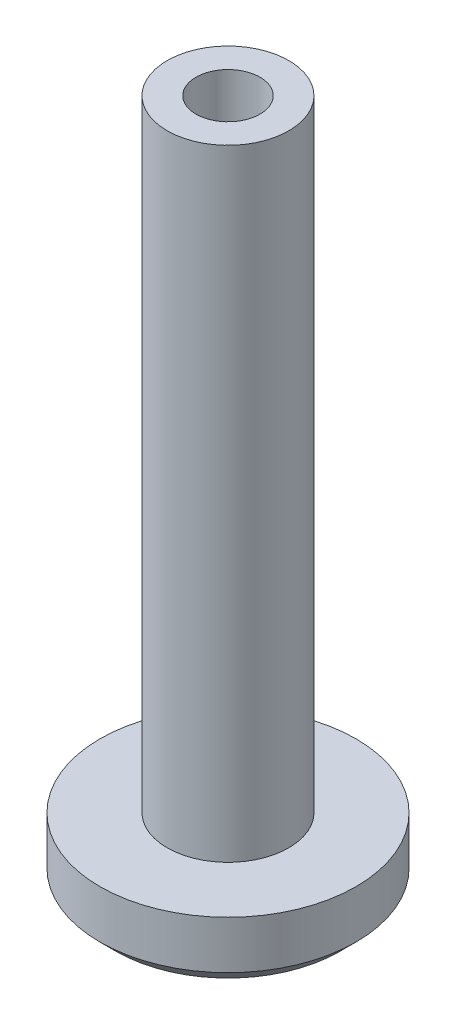
ISO-10303-21;
HEADER;
FILE_DESCRIPTION(('STEP AP214'),'2;1');
FILE_NAME('part.step','',(''),(''),'','','');
FILE_SCHEMA(('AUTOMOTIVE_DESIGN { 1 0 10303 214 1 1 1 1 }'));
ENDSEC;
DATA;
#1=APPLICATION_CONTEXT('core data for automotive mechanical design processes');
#2=APPLICATION_PROTOCOL_DEFINITION('international standard','automotive_design',2000,#1);
#3=PRODUCT_CONTEXT('',#1,'mechanical');
#4=PRODUCT('Part','Part','',(#3));
#5=PRODUCT_RELATED_PRODUCT_CATEGORY('part','',(#4));
#6=PRODUCT_DEFINITION_FORMATION('','',#4);
#7=PRODUCT_DEFINITION_CONTEXT('part definition',#1,'design');
#8=PRODUCT_DEFINITION('design','',#6,#7);
#9=PRODUCT_DEFINITION_SHAPE('','',#8);
#10=(LENGTH_UNIT() NAMED_UNIT(*) SI_UNIT(.MILLI.,.METRE.));
#11=(NAMED_UNIT(*) PLANE_ANGLE_UNIT() SI_UNIT($,.RADIAN.));
#12=(NAMED_UNIT(*) SI_UNIT($,.STERADIAN.) SOLID_ANGLE_UNIT());
#13=UNCERTAINTY_MEASURE_WITH_UNIT(LENGTH_MEASURE(1.E-05),#10,'distance_accuracy_value','');
#14=(GEOMETRIC_REPRESENTATION_CONTEXT(3) GLOBAL_UNCERTAINTY_ASSIGNED_CONTEXT((#13)) GLOBAL_UNIT_ASSIGNED_CONTEXT((#10,
#11,#12)) REPRESENTATION_CONTEXT('',''));
#15=CARTESIAN_POINT('',(0.,0.,0.));
#16=DIRECTION('',(0.,0.,1.));
#17=DIRECTION('',(1.,0.,0.));
#18=AXIS2_PLACEMENT_3D('',#15,#16,#17);
#19=CARTESIAN_POINT('',(0.,19.4,0.));
#20=DIRECTION('',(0.,-1.,0.));
#21=DIRECTION('',(0.,0.,-1.));
#22=AXIS2_PLACEMENT_3D('',#19,#20,#21);
#23=CYLINDRICAL_SURFACE('',#22,1.9);
#24=CARTESIAN_POINT('',(0.,19.4,0.));
#25=DIRECTION('',(0.,1.,0.));
#26=DIRECTION('',(0.,0.,1.));
#27=AXIS2_PLACEMENT_3D('',#24,#25,#26);
#28=CIRCLE('',#27,1.9);
#29=CARTESIAN_POINT('',(0.,19.4,1.9));
#30=VERTEX_POINT('',#29);
#31=EDGE_CURVE('E63',#30,#30,#28,.T.);
#32=ORIENTED_EDGE('',*,*,#31,.F.);
#33=EDGE_LOOP('',(#32));
#34=FACE_BOUND('',#33,.T.);
#35=CARTESIAN_POINT('',(0.,0.,0.));
#36=DIRECTION('',(0.,1.,0.));
#37=DIRECTION('',(0.,0.,1.));
#38=AXIS2_PLACEMENT_3D('',#35,#36,#37);
#39=CIRCLE('',#38,1.9);
#40=CARTESIAN_POINT('',(0.,0.,1.9));
#41=VERTEX_POINT('',#40);
#42=EDGE_CURVE('E69',#41,#41,#39,.T.);
#43=ORIENTED_EDGE('',*,*,#42,.T.);
#44=EDGE_LOOP('',(#43));
#45=FACE_BOUND('',#44,.T.);
#46=ADVANCED_FACE('F47',(#34,#45),#23,.T.);
#47=CARTESIAN_POINT('',(0.,19.4,0.));
#48=DIRECTION('',(0.,1.,0.));
#49=DIRECTION('',(0.,0.,1.));
#50=AXIS2_PLACEMENT_3D('',#47,#48,#49);
#51=PLANE('',#50);
#52=CARTESIAN_POINT('',(0.,19.4,0.));
#53=DIRECTION('',(0.,1.,0.));
#54=DIRECTION('',(0.,0.,1.));
#55=AXIS2_PLACEMENT_3D('',#52,#53,#54);
#56=CIRCLE('',#55,1.);
#57=CARTESIAN_POINT('',(0.,19.4,1.));
#58=VERTEX_POINT('',#57);
#59=EDGE_CURVE('E78',#58,#58,#56,.T.);
#60=ORIENTED_EDGE('',*,*,#59,.F.);
#61=EDGE_LOOP('',(#60));
#62=FACE_BOUND('',#61,.T.);
#63=ORIENTED_EDGE('',*,*,#31,.T.);
#64=EDGE_LOOP('',(#63));
#65=FACE_BOUND('',#64,.T.);
#66=ADVANCED_FACE('F93',(#62,#65),#51,.T.);
#67=CARTESIAN_POINT('',(0.,-2.,0.));
#68=DIRECTION('',(0.,1.,0.));
#69=DIRECTION('',(0.,0.,1.));
#70=AXIS2_PLACEMENT_3D('',#67,#68,#69);
#71=CYLINDRICAL_SURFACE('',#70,4.);
#72=CARTESIAN_POINT('',(0.,-1.5,0.));
#73=DIRECTION('',(0.,-1.,0.));
#74=DIRECTION('',(0.,0.,-1.));
#75=AXIS2_PLACEMENT_3D('',#72,#73,#74);
#76=CIRCLE('',#75,4.);
#77=CARTESIAN_POINT('',(0.,-1.5,-4.));
#78=VERTEX_POINT('',#77);
#79=EDGE_CURVE('E10',#78,#78,#76,.F.);
#80=ORIENTED_EDGE('',*,*,#79,.T.);
#81=EDGE_LOOP('',(#80));
#82=FACE_BOUND('',#81,.T.);
#83=CARTESIAN_POINT('',(0.,0.,0.));
#84=DIRECTION('',(0.,-1.,0.));
#85=DIRECTION('',(0.,0.,-1.));
#86=AXIS2_PLACEMENT_3D('',#83,#84,#85);
#87=CIRCLE('',#86,4.);
#88=CARTESIAN_POINT('',(0.,0.,-4.));
#89=VERTEX_POINT('',#88);
#90=EDGE_CURVE('E73',#89,#89,#87,.T.);
#91=ORIENTED_EDGE('',*,*,#90,.T.);
#92=EDGE_LOOP('',(#91));
#93=FACE_BOUND('',#92,.T.);
#94=ADVANCED_FACE('F96',(#82,#93),#71,.T.);
#95=CARTESIAN_POINT('',(0.,-2.,0.));
#96=DIRECTION('',(0.,-1.,0.));
#97=DIRECTION('',(0.,0.,-1.));
#98=AXIS2_PLACEMENT_3D('',#95,#96,#97);
#99=PLANE('',#98);
#100=CARTESIAN_POINT('',(0.,-2.,0.));
#101=DIRECTION('',(0.,-1.,0.));
#102=DIRECTION('',(0.,0.,-1.));
#103=AXIS2_PLACEMENT_3D('',#100,#101,#102);
#104=CIRCLE('',#103,3.5);
#105=CARTESIAN_POINT('',(0.,-2.,-3.5));
#106=VERTEX_POINT('',#105);
#107=EDGE_CURVE('E56',#106,#106,#104,.T.);
#108=ORIENTED_EDGE('',*,*,#107,.T.);
#109=EDGE_LOOP('',(#108));
#110=FACE_BOUND('',#109,.T.);
#111=ADVANCED_FACE('F107',(#110),#99,.T.);
#112=CARTESIAN_POINT('',(0.,0.,0.));
#113=DIRECTION('',(0.,-1.,0.));
#114=DIRECTION('',(0.,0.,-1.));
#115=AXIS2_PLACEMENT_3D('',#112,#113,#114);
#116=PLANE('',#115);
#117=ORIENTED_EDGE('',*,*,#42,.F.);
#118=EDGE_LOOP('',(#117));
#119=FACE_BOUND('',#118,.T.);
#120=ORIENTED_EDGE('',*,*,#90,.F.);
#121=EDGE_LOOP('',(#120));
#122=FACE_BOUND('',#121,.T.);
#123=ADVANCED_FACE('F104',(#119,#122),#116,.F.);
#124=CARTESIAN_POINT('',(0.,-2.,0.));
#125=DIRECTION('',(0.,1.,0.));
#126=DIRECTION('',(0.,0.,1.));
#127=AXIS2_PLACEMENT_3D('',#124,#125,#126);
#128=CONICAL_SURFACE('',#127,3.5,0.785398163397448);
#129=ORIENTED_EDGE('',*,*,#79,.F.);
#130=EDGE_LOOP('',(#129));
#131=FACE_BOUND('',#130,.T.);
#132=ORIENTED_EDGE('',*,*,#107,.F.);
#133=EDGE_LOOP('',(#132));
#134=FACE_BOUND('',#133,.T.);
#135=ADVANCED_FACE('F50',(#131,#134),#128,.T.);
#136=CARTESIAN_POINT('',(0.,16.4,0.));
#137=DIRECTION('',(0.,1.,0.));
#138=DIRECTION('',(0.,0.,1.));
#139=AXIS2_PLACEMENT_3D('',#136,#137,#138);
#140=CYLINDRICAL_SURFACE('',#139,1.);
#141=CARTESIAN_POINT('',(0.,16.4,0.));
#142=DIRECTION('',(0.,1.,0.));
#143=DIRECTION('',(0.,0.,1.));
#144=AXIS2_PLACEMENT_3D('',#141,#142,#143);
#145=CIRCLE('',#144,1.);
#146=CARTESIAN_POINT('',(0.,16.4,1.));
#147=VERTEX_POINT('',#146);
#148=EDGE_CURVE('E77',#147,#147,#145,.T.);
#149=ORIENTED_EDGE('',*,*,#148,.F.);
#150=EDGE_LOOP('',(#149));
#151=FACE_BOUND('',#150,.T.);
#152=ORIENTED_EDGE('',*,*,#59,.T.);
#153=EDGE_LOOP('',(#152));
#154=FACE_BOUND('',#153,.T.);
#155=ADVANCED_FACE('F87',(#151,#154),#140,.F.);
#156=CARTESIAN_POINT('',(0.,16.4,0.));
#157=DIRECTION('',(0.,1.,0.));
#158=DIRECTION('',(0.,0.,1.));
#159=AXIS2_PLACEMENT_3D('',#156,#157,#158);
#160=PLANE('',#159);
#161=ORIENTED_EDGE('',*,*,#148,.T.);
#162=EDGE_LOOP('',(#161));
#163=FACE_BOUND('',#162,.T.);
#164=ADVANCED_FACE('F85',(#163),#160,.T.);
#165=CLOSED_SHELL('',(#46,#66,#94,#111,#123,#135,#155,#164));
#166=MANIFOLD_SOLID_BREP('B2',#165);
#167=ADVANCED_BREP_SHAPE_REPRESENTATION('',(#18,#166),#14);
#168=SHAPE_DEFINITION_REPRESENTATION(#9,#167);
ENDSEC;
END-ISO-10303-21;
